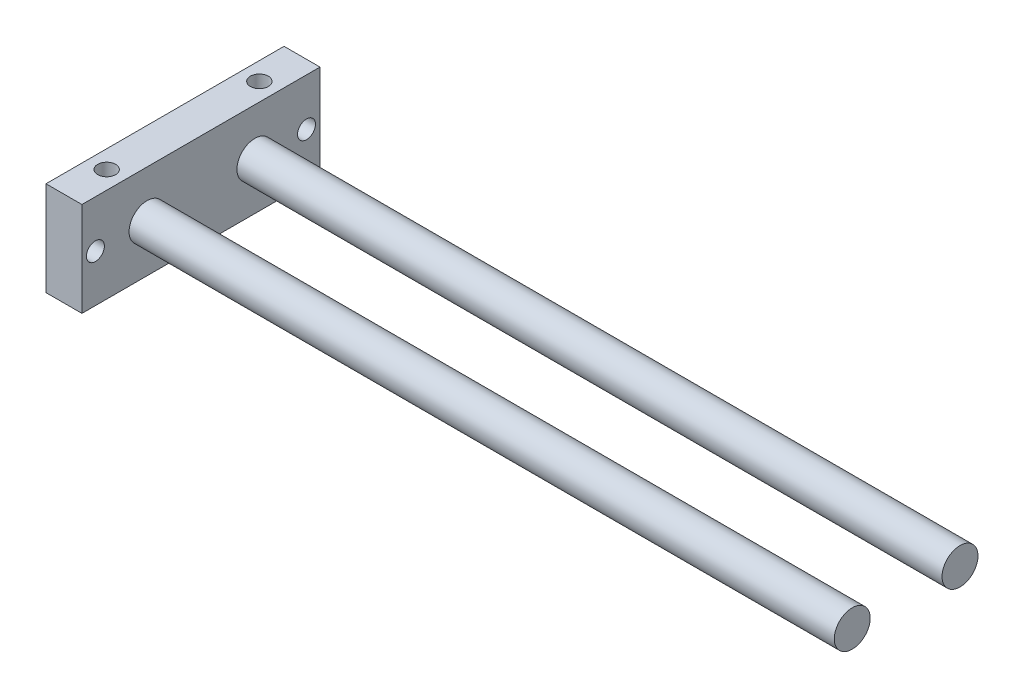
ISO-10303-21;
HEADER;
FILE_DESCRIPTION(('STEP AP214'),'2;1');
FILE_NAME('part.step','',(''),(''),'','','');
FILE_SCHEMA(('AUTOMOTIVE_DESIGN { 1 0 10303 214 1 1 1 1 }'));
ENDSEC;
DATA;
#1=APPLICATION_CONTEXT('core data for automotive mechanical design processes');
#2=APPLICATION_PROTOCOL_DEFINITION('international standard','automotive_design',2000,#1);
#3=PRODUCT_CONTEXT('',#1,'mechanical');
#4=PRODUCT('Part','Part','',(#3));
#5=PRODUCT_RELATED_PRODUCT_CATEGORY('part','',(#4));
#6=PRODUCT_DEFINITION_FORMATION('','',#4);
#7=PRODUCT_DEFINITION_CONTEXT('part definition',#1,'design');
#8=PRODUCT_DEFINITION('design','',#6,#7);
#9=PRODUCT_DEFINITION_SHAPE('','',#8);
#10=(LENGTH_UNIT() NAMED_UNIT(*) SI_UNIT(.MILLI.,.METRE.));
#11=(NAMED_UNIT(*) PLANE_ANGLE_UNIT() SI_UNIT($,.RADIAN.));
#12=(NAMED_UNIT(*) SI_UNIT($,.STERADIAN.) SOLID_ANGLE_UNIT());
#13=UNCERTAINTY_MEASURE_WITH_UNIT(LENGTH_MEASURE(1.E-05),#10,'distance_accuracy_value','');
#14=(GEOMETRIC_REPRESENTATION_CONTEXT(3) GLOBAL_UNCERTAINTY_ASSIGNED_CONTEXT((#13)) GLOBAL_UNIT_ASSIGNED_CONTEXT((#10,
#11,#12)) REPRESENTATION_CONTEXT('',''));
#15=CARTESIAN_POINT('',(0.,0.,0.));
#16=DIRECTION('',(0.,0.,1.));
#17=DIRECTION('',(1.,0.,0.));
#18=AXIS2_PLACEMENT_3D('',#15,#16,#17);
#19=CARTESIAN_POINT('',(8.,0.,0.));
#20=DIRECTION('',(-1.,0.,0.));
#21=DIRECTION('',(0.,0.,1.));
#22=AXIS2_PLACEMENT_3D('',#19,#20,#21);
#23=PLANE('',#22);
#24=CARTESIAN_POINT('',(8.00000000000001,10.5,-38.5));
#25=DIRECTION('',(-1.,0.,0.));
#26=DIRECTION('',(0.,0.,1.));
#27=AXIS2_PLACEMENT_3D('',#24,#25,#26);
#28=CIRCLE('',#27,4.00000000000001);
#29=CARTESIAN_POINT('',(8.00000000000001,10.5,-34.5));
#30=VERTEX_POINT('',#29);
#31=EDGE_CURVE('E44',#30,#30,#28,.F.);
#32=ORIENTED_EDGE('',*,*,#31,.F.);
#33=EDGE_LOOP('',(#32));
#34=FACE_BOUND('',#33,.T.);
#35=CARTESIAN_POINT('',(8.,10.5,-50.));
#36=DIRECTION('',(1.,0.,0.));
#37=DIRECTION('',(0.,0.,-1.));
#38=AXIS2_PLACEMENT_3D('',#35,#36,#37);
#39=CIRCLE('',#38,2.);
#40=CARTESIAN_POINT('',(8.,10.5,-52.));
#41=VERTEX_POINT('',#40);
#42=EDGE_CURVE('E106',#41,#41,#39,.T.);
#43=ORIENTED_EDGE('',*,*,#42,.F.);
#44=EDGE_LOOP('',(#43));
#45=FACE_BOUND('',#44,.T.);
#46=DIRECTION('',(0.,-1.,0.));
#47=VECTOR('',#46,1.);
#48=CARTESIAN_POINT('',(8.,0.,0.));
#49=LINE('',#48,#47);
#50=CARTESIAN_POINT('',(8.,21.,0.));
#51=VERTEX_POINT('',#50);
#52=CARTESIAN_POINT('',(8.,0.,0.));
#53=VERTEX_POINT('',#52);
#54=EDGE_CURVE('E88',#51,#53,#49,.T.);
#55=ORIENTED_EDGE('',*,*,#54,.T.);
#56=DIRECTION('',(0.,0.,-1.));
#57=VECTOR('',#56,1.);
#58=CARTESIAN_POINT('',(8.,0.,0.));
#59=LINE('',#58,#57);
#60=CARTESIAN_POINT('',(8.,0.,-53.));
#61=VERTEX_POINT('',#60);
#62=EDGE_CURVE('E83',#53,#61,#59,.T.);
#63=ORIENTED_EDGE('',*,*,#62,.T.);
#64=DIRECTION('',(0.,1.,0.));
#65=VECTOR('',#64,1.);
#66=CARTESIAN_POINT('',(8.,0.,-53.));
#67=LINE('',#66,#65);
#68=CARTESIAN_POINT('',(8.,21.,-53.));
#69=VERTEX_POINT('',#68);
#70=EDGE_CURVE('E86',#61,#69,#67,.T.);
#71=ORIENTED_EDGE('',*,*,#70,.T.);
#72=DIRECTION('',(0.,0.,1.));
#73=VECTOR('',#72,1.);
#74=CARTESIAN_POINT('',(8.,21.,0.));
#75=LINE('',#74,#73);
#76=EDGE_CURVE('E52',#69,#51,#75,.T.);
#77=ORIENTED_EDGE('',*,*,#76,.T.);
#78=EDGE_LOOP('',(#55,#63,#71,#77));
#79=FACE_BOUND('',#78,.T.);
#80=CARTESIAN_POINT('',(8.,10.5,-3.));
#81=DIRECTION('',(1.,0.,0.));
#82=DIRECTION('',(0.,0.,1.));
#83=AXIS2_PLACEMENT_3D('',#80,#81,#82);
#84=CIRCLE('',#83,2.);
#85=CARTESIAN_POINT('',(8.,10.5,-0.999999999999992));
#86=VERTEX_POINT('',#85);
#87=EDGE_CURVE('E127',#86,#86,#84,.T.);
#88=ORIENTED_EDGE('',*,*,#87,.F.);
#89=EDGE_LOOP('',(#88));
#90=FACE_BOUND('',#89,.T.);
#91=CARTESIAN_POINT('',(8.00000000000001,10.5,-14.5));
#92=DIRECTION('',(-1.,0.,0.));
#93=DIRECTION('',(0.,0.,1.));
#94=AXIS2_PLACEMENT_3D('',#91,#92,#93);
#95=CIRCLE('',#94,4.);
#96=CARTESIAN_POINT('',(8.00000000000001,10.5,-10.5));
#97=VERTEX_POINT('',#96);
#98=EDGE_CURVE('E11',#97,#97,#95,.F.);
#99=ORIENTED_EDGE('',*,*,#98,.F.);
#100=EDGE_LOOP('',(#99));
#101=FACE_BOUND('',#100,.T.);
#102=ADVANCED_FACE('F35',(#34,#45,#79,#90,#101),#23,.F.);
#103=CARTESIAN_POINT('',(0.,0.,0.));
#104=DIRECTION('',(-1.,0.,0.));
#105=DIRECTION('',(0.,0.,1.));
#106=AXIS2_PLACEMENT_3D('',#103,#104,#105);
#107=PLANE('',#106);
#108=CARTESIAN_POINT('',(0.,10.5,-38.5));
#109=DIRECTION('',(-1.,0.,0.));
#110=DIRECTION('',(0.,0.,-1.));
#111=AXIS2_PLACEMENT_3D('',#108,#109,#110);
#112=CIRCLE('',#111,4.);
#113=CARTESIAN_POINT('',(0.,10.5,-42.5));
#114=VERTEX_POINT('',#113);
#115=EDGE_CURVE('E142',#114,#114,#112,.T.);
#116=ORIENTED_EDGE('',*,*,#115,.F.);
#117=EDGE_LOOP('',(#116));
#118=FACE_BOUND('',#117,.T.);
#119=CARTESIAN_POINT('',(0.,10.5,-14.5));
#120=DIRECTION('',(-1.,0.,0.));
#121=DIRECTION('',(0.,0.,1.));
#122=AXIS2_PLACEMENT_3D('',#119,#120,#121);
#123=CIRCLE('',#122,4.);
#124=CARTESIAN_POINT('',(0.,10.5,-10.5));
#125=VERTEX_POINT('',#124);
#126=EDGE_CURVE('E136',#125,#125,#123,.T.);
#127=ORIENTED_EDGE('',*,*,#126,.F.);
#128=EDGE_LOOP('',(#127));
#129=FACE_BOUND('',#128,.T.);
#130=CARTESIAN_POINT('',(0.,10.5,-50.));
#131=DIRECTION('',(1.,0.,0.));
#132=DIRECTION('',(0.,0.,-1.));
#133=AXIS2_PLACEMENT_3D('',#130,#131,#132);
#134=CIRCLE('',#133,2.);
#135=CARTESIAN_POINT('',(0.,10.5,-52.));
#136=VERTEX_POINT('',#135);
#137=EDGE_CURVE('E124',#136,#136,#134,.T.);
#138=ORIENTED_EDGE('',*,*,#137,.T.);
#139=EDGE_LOOP('',(#138));
#140=FACE_BOUND('',#139,.T.);
#141=DIRECTION('',(0.,-1.,0.));
#142=VECTOR('',#141,1.);
#143=CARTESIAN_POINT('',(0.,0.,0.));
#144=LINE('',#143,#142);
#145=CARTESIAN_POINT('',(0.,21.,0.));
#146=VERTEX_POINT('',#145);
#147=CARTESIAN_POINT('',(0.,0.,0.));
#148=VERTEX_POINT('',#147);
#149=EDGE_CURVE('E103',#146,#148,#144,.T.);
#150=ORIENTED_EDGE('',*,*,#149,.F.);
#151=DIRECTION('',(0.,0.,1.));
#152=VECTOR('',#151,1.);
#153=CARTESIAN_POINT('',(0.,21.,0.));
#154=LINE('',#153,#152);
#155=CARTESIAN_POINT('',(0.,21.,-53.));
#156=VERTEX_POINT('',#155);
#157=EDGE_CURVE('E75',#156,#146,#154,.T.);
#158=ORIENTED_EDGE('',*,*,#157,.F.);
#159=DIRECTION('',(0.,1.,0.));
#160=VECTOR('',#159,1.);
#161=CARTESIAN_POINT('',(0.,0.,-53.));
#162=LINE('',#161,#160);
#163=CARTESIAN_POINT('',(0.,0.,-53.));
#164=VERTEX_POINT('',#163);
#165=EDGE_CURVE('E69',#164,#156,#162,.T.);
#166=ORIENTED_EDGE('',*,*,#165,.F.);
#167=DIRECTION('',(0.,0.,-1.));
#168=VECTOR('',#167,1.);
#169=CARTESIAN_POINT('',(0.,0.,0.));
#170=LINE('',#169,#168);
#171=EDGE_CURVE('E93',#148,#164,#170,.T.);
#172=ORIENTED_EDGE('',*,*,#171,.F.);
#173=EDGE_LOOP('',(#150,#158,#166,#172));
#174=FACE_BOUND('',#173,.T.);
#175=CARTESIAN_POINT('',(0.,10.5,-3.));
#176=DIRECTION('',(1.,0.,0.));
#177=DIRECTION('',(0.,0.,1.));
#178=AXIS2_PLACEMENT_3D('',#175,#176,#177);
#179=CIRCLE('',#178,2.);
#180=CARTESIAN_POINT('',(0.,10.5,-0.999999999999992));
#181=VERTEX_POINT('',#180);
#182=EDGE_CURVE('E130',#181,#181,#179,.T.);
#183=ORIENTED_EDGE('',*,*,#182,.T.);
#184=EDGE_LOOP('',(#183));
#185=FACE_BOUND('',#184,.T.);
#186=ADVANCED_FACE('F119',(#118,#129,#140,#174,#185),#107,.T.);
#187=CARTESIAN_POINT('',(8.,0.,0.));
#188=DIRECTION('',(0.,0.,-1.));
#189=DIRECTION('',(0.,1.,0.));
#190=AXIS2_PLACEMENT_3D('',#187,#188,#189);
#191=PLANE('',#190);
#192=ORIENTED_EDGE('',*,*,#149,.T.);
#193=DIRECTION('',(-1.,0.,0.));
#194=VECTOR('',#193,1.);
#195=CARTESIAN_POINT('',(8.,0.,0.));
#196=LINE('',#195,#194);
#197=EDGE_CURVE('E94',#53,#148,#196,.T.);
#198=ORIENTED_EDGE('',*,*,#197,.F.);
#199=ORIENTED_EDGE('',*,*,#54,.F.);
#200=DIRECTION('',(-1.,0.,0.));
#201=VECTOR('',#200,1.);
#202=CARTESIAN_POINT('',(8.,21.,0.));
#203=LINE('',#202,#201);
#204=EDGE_CURVE('E99',#51,#146,#203,.T.);
#205=ORIENTED_EDGE('',*,*,#204,.T.);
#206=EDGE_LOOP('',(#192,#198,#199,#205));
#207=FACE_BOUND('',#206,.T.);
#208=ADVANCED_FACE('F37',(#207),#191,.F.);
#209=CARTESIAN_POINT('',(8.,0.,0.));
#210=DIRECTION('',(0.,1.,0.));
#211=DIRECTION('',(0.,0.,1.));
#212=AXIS2_PLACEMENT_3D('',#209,#210,#211);
#213=PLANE('',#212);
#214=ORIENTED_EDGE('',*,*,#171,.T.);
#215=DIRECTION('',(-1.,0.,0.));
#216=VECTOR('',#215,1.);
#217=CARTESIAN_POINT('',(8.,0.,-53.));
#218=LINE('',#217,#216);
#219=EDGE_CURVE('E91',#61,#164,#218,.T.);
#220=ORIENTED_EDGE('',*,*,#219,.F.);
#221=ORIENTED_EDGE('',*,*,#62,.F.);
#222=ORIENTED_EDGE('',*,*,#197,.T.);
#223=EDGE_LOOP('',(#214,#220,#221,#222));
#224=FACE_BOUND('',#223,.T.);
#225=ADVANCED_FACE('F92',(#224),#213,.F.);
#226=CARTESIAN_POINT('',(8.,0.,-53.));
#227=DIRECTION('',(0.,0.,1.));
#228=DIRECTION('',(0.,-1.,0.));
#229=AXIS2_PLACEMENT_3D('',#226,#227,#228);
#230=PLANE('',#229);
#231=ORIENTED_EDGE('',*,*,#165,.T.);
#232=DIRECTION('',(-1.,0.,0.));
#233=VECTOR('',#232,1.);
#234=CARTESIAN_POINT('',(8.,21.,-53.));
#235=LINE('',#234,#233);
#236=EDGE_CURVE('E95',#69,#156,#235,.T.);
#237=ORIENTED_EDGE('',*,*,#236,.F.);
#238=ORIENTED_EDGE('',*,*,#70,.F.);
#239=ORIENTED_EDGE('',*,*,#219,.T.);
#240=EDGE_LOOP('',(#231,#237,#238,#239));
#241=FACE_BOUND('',#240,.T.);
#242=ADVANCED_FACE('F97',(#241),#230,.F.);
#243=CARTESIAN_POINT('',(8.,21.,0.));
#244=DIRECTION('',(0.,-1.,0.));
#245=DIRECTION('',(0.,0.,-1.));
#246=AXIS2_PLACEMENT_3D('',#243,#244,#245);
#247=PLANE('',#246);
#248=CARTESIAN_POINT('',(4.,21.,-9.49999999999999));
#249=DIRECTION('',(0.,1.,0.));
#250=DIRECTION('',(0.,0.,-1.));
#251=AXIS2_PLACEMENT_3D('',#248,#249,#250);
#252=CIRCLE('',#251,2.);
#253=CARTESIAN_POINT('',(4.,21.,-11.5));
#254=VERTEX_POINT('',#253);
#255=EDGE_CURVE('E160',#254,#254,#252,.T.);
#256=ORIENTED_EDGE('',*,*,#255,.F.);
#257=EDGE_LOOP('',(#256));
#258=FACE_BOUND('',#257,.T.);
#259=CARTESIAN_POINT('',(4.,21.,-43.5));
#260=DIRECTION('',(0.,1.,0.));
#261=DIRECTION('',(0.,0.,1.));
#262=AXIS2_PLACEMENT_3D('',#259,#260,#261);
#263=CIRCLE('',#262,2.);
#264=CARTESIAN_POINT('',(4.,21.,-41.5));
#265=VERTEX_POINT('',#264);
#266=EDGE_CURVE('E154',#265,#265,#263,.T.);
#267=ORIENTED_EDGE('',*,*,#266,.F.);
#268=EDGE_LOOP('',(#267));
#269=FACE_BOUND('',#268,.T.);
#270=ORIENTED_EDGE('',*,*,#157,.T.);
#271=ORIENTED_EDGE('',*,*,#204,.F.);
#272=ORIENTED_EDGE('',*,*,#76,.F.);
#273=ORIENTED_EDGE('',*,*,#236,.T.);
#274=EDGE_LOOP('',(#270,#271,#272,#273));
#275=FACE_BOUND('',#274,.T.);
#276=ADVANCED_FACE('F175',(#258,#269,#275),#247,.F.);
#277=CARTESIAN_POINT('',(8.,10.5,-50.));
#278=DIRECTION('',(-1.,0.,0.));
#279=DIRECTION('',(0.,0.,1.));
#280=AXIS2_PLACEMENT_3D('',#277,#278,#279);
#281=CYLINDRICAL_SURFACE('',#280,2.);
#282=ORIENTED_EDGE('',*,*,#42,.T.);
#283=EDGE_LOOP('',(#282));
#284=FACE_BOUND('',#283,.T.);
#285=ORIENTED_EDGE('',*,*,#137,.F.);
#286=EDGE_LOOP('',(#285));
#287=FACE_BOUND('',#286,.T.);
#288=ADVANCED_FACE('F178',(#284,#287),#281,.F.);
#289=CARTESIAN_POINT('',(8.,10.5,-3.));
#290=DIRECTION('',(-1.,0.,0.));
#291=DIRECTION('',(0.,0.,1.));
#292=AXIS2_PLACEMENT_3D('',#289,#290,#291);
#293=CYLINDRICAL_SURFACE('',#292,2.);
#294=ORIENTED_EDGE('',*,*,#87,.T.);
#295=EDGE_LOOP('',(#294));
#296=FACE_BOUND('',#295,.T.);
#297=ORIENTED_EDGE('',*,*,#182,.F.);
#298=EDGE_LOOP('',(#297));
#299=FACE_BOUND('',#298,.T.);
#300=ADVANCED_FACE('F223',(#296,#299),#293,.F.);
#301=CARTESIAN_POINT('',(5.,10.5,-14.5));
#302=DIRECTION('',(-1.,0.,0.));
#303=DIRECTION('',(0.,0.,1.));
#304=AXIS2_PLACEMENT_3D('',#301,#302,#303);
#305=CYLINDRICAL_SURFACE('',#304,4.);
#306=CARTESIAN_POINT('',(5.,10.5,-14.5));
#307=DIRECTION('',(-1.,0.,0.));
#308=DIRECTION('',(0.,0.,1.));
#309=AXIS2_PLACEMENT_3D('',#306,#307,#308);
#310=CIRCLE('',#309,4.);
#311=CARTESIAN_POINT('',(5.,10.5,-10.5));
#312=VERTEX_POINT('',#311);
#313=EDGE_CURVE('E133',#312,#312,#310,.T.);
#314=ORIENTED_EDGE('',*,*,#313,.F.);
#315=EDGE_LOOP('',(#314));
#316=FACE_BOUND('',#315,.T.);
#317=ORIENTED_EDGE('',*,*,#126,.T.);
#318=EDGE_LOOP('',(#317));
#319=FACE_BOUND('',#318,.T.);
#320=ADVANCED_FACE('F219',(#316,#319),#305,.F.);
#321=CARTESIAN_POINT('',(5.,10.5,-14.5));
#322=DIRECTION('',(-1.,0.,0.));
#323=DIRECTION('',(0.,0.,1.));
#324=AXIS2_PLACEMENT_3D('',#321,#322,#323);
#325=PLANE('',#324);
#326=ORIENTED_EDGE('',*,*,#313,.T.);
#327=EDGE_LOOP('',(#326));
#328=FACE_BOUND('',#327,.T.);
#329=ADVANCED_FACE('F215',(#328),#325,.T.);
#330=CARTESIAN_POINT('',(5.,10.5,-38.5));
#331=DIRECTION('',(-1.,0.,0.));
#332=DIRECTION('',(0.,0.,1.));
#333=AXIS2_PLACEMENT_3D('',#330,#331,#332);
#334=CYLINDRICAL_SURFACE('',#333,4.);
#335=CARTESIAN_POINT('',(5.,10.5,-38.5));
#336=DIRECTION('',(-1.,0.,0.));
#337=DIRECTION('',(0.,0.,-1.));
#338=AXIS2_PLACEMENT_3D('',#335,#336,#337);
#339=CIRCLE('',#338,4.);
#340=CARTESIAN_POINT('',(5.,10.5,-42.5));
#341=VERTEX_POINT('',#340);
#342=EDGE_CURVE('E139',#341,#341,#339,.T.);
#343=ORIENTED_EDGE('',*,*,#342,.F.);
#344=EDGE_LOOP('',(#343));
#345=FACE_BOUND('',#344,.T.);
#346=ORIENTED_EDGE('',*,*,#115,.T.);
#347=EDGE_LOOP('',(#346));
#348=FACE_BOUND('',#347,.T.);
#349=ADVANCED_FACE('F211',(#345,#348),#334,.F.);
#350=CARTESIAN_POINT('',(5.,10.5,-38.5));
#351=DIRECTION('',(1.,0.,0.));
#352=DIRECTION('',(0.,0.,-1.));
#353=AXIS2_PLACEMENT_3D('',#350,#351,#352);
#354=PLANE('',#353);
#355=ORIENTED_EDGE('',*,*,#342,.T.);
#356=EDGE_LOOP('',(#355));
#357=FACE_BOUND('',#356,.T.);
#358=ADVANCED_FACE('F207',(#357),#354,.F.);
#359=CARTESIAN_POINT('',(165.,10.5,-38.5));
#360=DIRECTION('',(-1.,0.,0.));
#361=DIRECTION('',(0.,0.,1.));
#362=AXIS2_PLACEMENT_3D('',#359,#360,#361);
#363=CYLINDRICAL_SURFACE('',#362,4.00000000000001);
#364=CARTESIAN_POINT('',(165.,10.5,-38.5));
#365=DIRECTION('',(1.,0.,0.));
#366=DIRECTION('',(0.,0.,-1.));
#367=AXIS2_PLACEMENT_3D('',#364,#365,#366);
#368=CIRCLE('',#367,4.00000000000001);
#369=CARTESIAN_POINT('',(165.,10.5,-42.5));
#370=VERTEX_POINT('',#369);
#371=EDGE_CURVE('E145',#370,#370,#368,.T.);
#372=ORIENTED_EDGE('',*,*,#371,.F.);
#373=EDGE_LOOP('',(#372));
#374=FACE_BOUND('',#373,.T.);
#375=ORIENTED_EDGE('',*,*,#31,.T.);
#376=EDGE_LOOP('',(#375));
#377=FACE_BOUND('',#376,.T.);
#378=ADVANCED_FACE('F115',(#374,#377),#363,.T.);
#379=CARTESIAN_POINT('',(165.,10.5,-38.5));
#380=DIRECTION('',(1.,0.,0.));
#381=DIRECTION('',(0.,0.,-1.));
#382=AXIS2_PLACEMENT_3D('',#379,#380,#381);
#383=PLANE('',#382);
#384=ORIENTED_EDGE('',*,*,#371,.T.);
#385=EDGE_LOOP('',(#384));
#386=FACE_BOUND('',#385,.T.);
#387=ADVANCED_FACE('F200',(#386),#383,.T.);
#388=CARTESIAN_POINT('',(165.,10.5,-14.5));
#389=DIRECTION('',(-1.,0.,0.));
#390=DIRECTION('',(0.,0.,1.));
#391=AXIS2_PLACEMENT_3D('',#388,#389,#390);
#392=CYLINDRICAL_SURFACE('',#391,4.);
#393=CARTESIAN_POINT('',(165.,10.5,-14.5));
#394=DIRECTION('',(1.,0.,0.));
#395=DIRECTION('',(0.,0.,1.));
#396=AXIS2_PLACEMENT_3D('',#393,#394,#395);
#397=CIRCLE('',#396,4.);
#398=CARTESIAN_POINT('',(165.,10.5,-10.5));
#399=VERTEX_POINT('',#398);
#400=EDGE_CURVE('E150',#399,#399,#397,.T.);
#401=ORIENTED_EDGE('',*,*,#400,.F.);
#402=EDGE_LOOP('',(#401));
#403=FACE_BOUND('',#402,.T.);
#404=ORIENTED_EDGE('',*,*,#98,.T.);
#405=EDGE_LOOP('',(#404));
#406=FACE_BOUND('',#405,.T.);
#407=ADVANCED_FACE('F193',(#403,#406),#392,.T.);
#408=CARTESIAN_POINT('',(165.,10.5,-14.5));
#409=DIRECTION('',(-1.,0.,0.));
#410=DIRECTION('',(0.,0.,1.));
#411=AXIS2_PLACEMENT_3D('',#408,#409,#410);
#412=PLANE('',#411);
#413=ORIENTED_EDGE('',*,*,#400,.T.);
#414=EDGE_LOOP('',(#413));
#415=FACE_BOUND('',#414,.T.);
#416=ADVANCED_FACE('F184',(#415),#412,.F.);
#417=CARTESIAN_POINT('',(4.,16.,-43.5));
#418=DIRECTION('',(0.,1.,0.));
#419=DIRECTION('',(0.,0.,1.));
#420=AXIS2_PLACEMENT_3D('',#417,#418,#419);
#421=CYLINDRICAL_SURFACE('',#420,2.);
#422=CARTESIAN_POINT('',(4.,16.,-43.5));
#423=DIRECTION('',(0.,1.,0.));
#424=DIRECTION('',(0.,0.,1.));
#425=AXIS2_PLACEMENT_3D('',#422,#423,#424);
#426=CIRCLE('',#425,2.);
#427=CARTESIAN_POINT('',(4.,16.,-41.5));
#428=VERTEX_POINT('',#427);
#429=EDGE_CURVE('E153',#428,#428,#426,.T.);
#430=ORIENTED_EDGE('',*,*,#429,.F.);
#431=EDGE_LOOP('',(#430));
#432=FACE_BOUND('',#431,.T.);
#433=ORIENTED_EDGE('',*,*,#266,.T.);
#434=EDGE_LOOP('',(#433));
#435=FACE_BOUND('',#434,.T.);
#436=ADVANCED_FACE('F182',(#432,#435),#421,.F.);
#437=CARTESIAN_POINT('',(4.,16.,-43.5));
#438=DIRECTION('',(0.,1.,0.));
#439=DIRECTION('',(0.,0.,1.));
#440=AXIS2_PLACEMENT_3D('',#437,#438,#439);
#441=PLANE('',#440);
#442=ORIENTED_EDGE('',*,*,#429,.T.);
#443=EDGE_LOOP('',(#442));
#444=FACE_BOUND('',#443,.T.);
#445=ADVANCED_FACE('F171',(#444),#441,.T.);
#446=CARTESIAN_POINT('',(4.,16.,-9.49999999999999));
#447=DIRECTION('',(0.,1.,0.));
#448=DIRECTION('',(0.,0.,1.));
#449=AXIS2_PLACEMENT_3D('',#446,#447,#448);
#450=CYLINDRICAL_SURFACE('',#449,2.);
#451=CARTESIAN_POINT('',(4.,16.,-9.49999999999999));
#452=DIRECTION('',(0.,1.,0.));
#453=DIRECTION('',(0.,0.,-1.));
#454=AXIS2_PLACEMENT_3D('',#451,#452,#453);
#455=CIRCLE('',#454,2.);
#456=CARTESIAN_POINT('',(4.,16.,-11.5));
#457=VERTEX_POINT('',#456);
#458=EDGE_CURVE('E157',#457,#457,#455,.T.);
#459=ORIENTED_EDGE('',*,*,#458,.F.);
#460=EDGE_LOOP('',(#459));
#461=FACE_BOUND('',#460,.T.);
#462=ORIENTED_EDGE('',*,*,#255,.T.);
#463=EDGE_LOOP('',(#462));
#464=FACE_BOUND('',#463,.T.);
#465=ADVANCED_FACE('F168',(#461,#464),#450,.F.);
#466=CARTESIAN_POINT('',(4.,16.,-9.49999999999999));
#467=DIRECTION('',(0.,-1.,0.));
#468=DIRECTION('',(0.,0.,-1.));
#469=AXIS2_PLACEMENT_3D('',#466,#467,#468);
#470=PLANE('',#469);
#471=ORIENTED_EDGE('',*,*,#458,.T.);
#472=EDGE_LOOP('',(#471));
#473=FACE_BOUND('',#472,.T.);
#474=ADVANCED_FACE('F166',(#473),#470,.F.);
#475=CLOSED_SHELL('',(#102,#186,#208,#225,#242,#276,#288,#300,#320,#329,#349,#358,#378,#387,
#407,#416,#436,#445,#465,#474));
#476=MANIFOLD_SOLID_BREP('B2',#475);
#477=ADVANCED_BREP_SHAPE_REPRESENTATION('',(#18,#476),#14);
#478=SHAPE_DEFINITION_REPRESENTATION(#9,#477);
ENDSEC;
END-ISO-10303-21;
